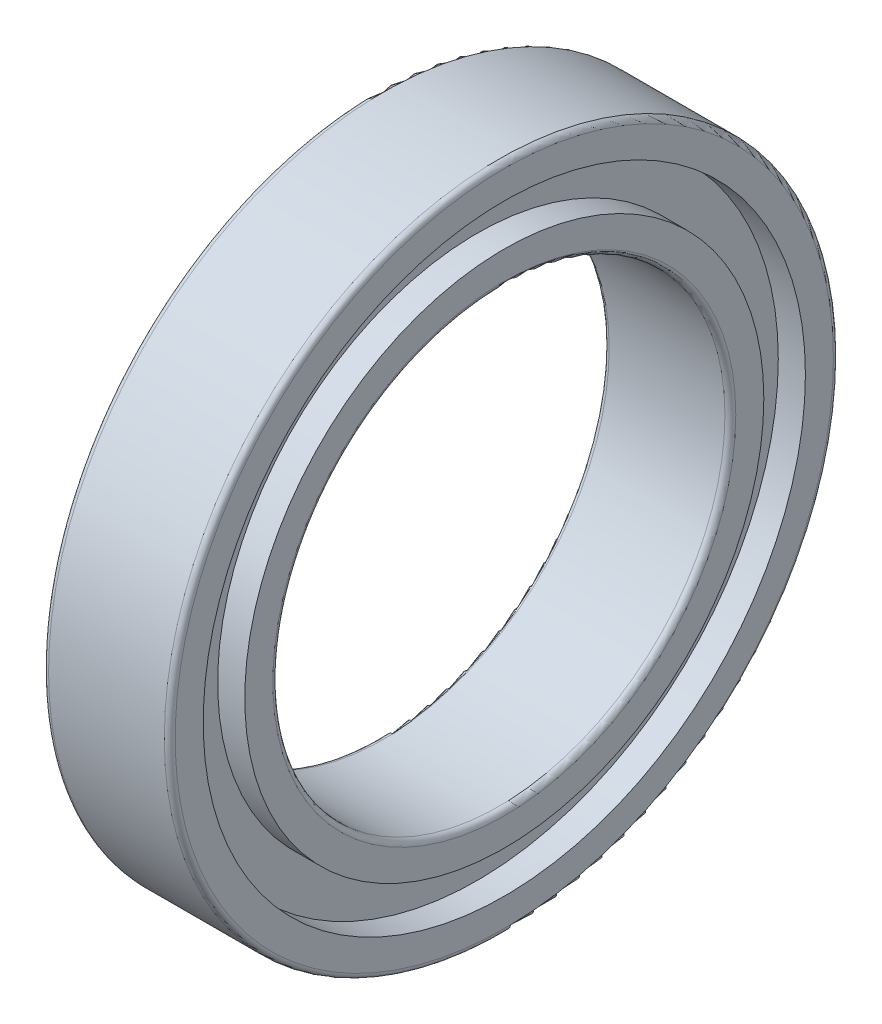
ISO-10303-21;
HEADER;
FILE_DESCRIPTION(('STEP AP214'),'2;1');
FILE_NAME('part.step','',(''),(''),'','','');
FILE_SCHEMA(('AUTOMOTIVE_DESIGN { 1 0 10303 214 1 1 1 1 }'));
ENDSEC;
DATA;
#1=APPLICATION_CONTEXT('core data for automotive mechanical design processes');
#2=APPLICATION_PROTOCOL_DEFINITION('international standard','automotive_design',2000,#1);
#3=PRODUCT_CONTEXT('',#1,'mechanical');
#4=PRODUCT('Part','Part','',(#3));
#5=PRODUCT_RELATED_PRODUCT_CATEGORY('part','',(#4));
#6=PRODUCT_DEFINITION_FORMATION('','',#4);
#7=PRODUCT_DEFINITION_CONTEXT('part definition',#1,'design');
#8=PRODUCT_DEFINITION('design','',#6,#7);
#9=PRODUCT_DEFINITION_SHAPE('','',#8);
#10=(LENGTH_UNIT() NAMED_UNIT(*) SI_UNIT(.MILLI.,.METRE.));
#11=(NAMED_UNIT(*) PLANE_ANGLE_UNIT() SI_UNIT($,.RADIAN.));
#12=(NAMED_UNIT(*) SI_UNIT($,.STERADIAN.) SOLID_ANGLE_UNIT());
#13=UNCERTAINTY_MEASURE_WITH_UNIT(LENGTH_MEASURE(1.E-05),#10,'distance_accuracy_value','');
#14=(GEOMETRIC_REPRESENTATION_CONTEXT(3) GLOBAL_UNCERTAINTY_ASSIGNED_CONTEXT((#13)) GLOBAL_UNIT_ASSIGNED_CONTEXT((#10,
#11,#12)) REPRESENTATION_CONTEXT('',''));
#15=CARTESIAN_POINT('',(0.,0.,0.));
#16=DIRECTION('',(0.,0.,1.));
#17=DIRECTION('',(1.,0.,0.));
#18=AXIS2_PLACEMENT_3D('',#15,#16,#17);
#19=CARTESIAN_POINT('',(-3.2,0.,0.));
#20=DIRECTION('',(1.,0.,0.));
#21=DIRECTION('',(0.,0.,-1.));
#22=AXIS2_PLACEMENT_3D('',#19,#20,#21);
#23=TOROIDAL_SURFACE('',#22,18.2,0.3);
#24=CARTESIAN_POINT('',(-3.5,0.,0.));
#25=DIRECTION('',(1.,0.,0.));
#26=DIRECTION('',(0.,0.,-1.));
#27=AXIS2_PLACEMENT_3D('',#24,#25,#26);
#28=CIRCLE('',#27,18.2);
#29=CARTESIAN_POINT('',(-3.5,0.,-18.2));
#30=VERTEX_POINT('',#29);
#31=EDGE_CURVE('E10',#30,#30,#28,.T.);
#32=ORIENTED_EDGE('',*,*,#31,.T.);
#33=EDGE_LOOP('',(#32));
#34=FACE_BOUND('',#33,.T.);
#35=CARTESIAN_POINT('',(-3.2,0.,0.));
#36=DIRECTION('',(1.,0.,0.));
#37=DIRECTION('',(0.,0.,-1.));
#38=AXIS2_PLACEMENT_3D('',#35,#36,#37);
#39=CIRCLE('',#38,18.5);
#40=CARTESIAN_POINT('',(-3.2,0.,-18.5));
#41=VERTEX_POINT('',#40);
#42=EDGE_CURVE('E123',#41,#41,#39,.T.);
#43=ORIENTED_EDGE('',*,*,#42,.F.);
#44=EDGE_LOOP('',(#43));
#45=FACE_BOUND('',#44,.T.);
#46=ADVANCED_FACE('F16',(#34,#45),#23,.T.);
#47=CARTESIAN_POINT('',(-3.5,16.65,0.));
#48=DIRECTION('',(1.,0.,0.));
#49=DIRECTION('',(0.,1.,0.));
#50=AXIS2_PLACEMENT_3D('',#47,#48,#49);
#51=PLANE('',#50);
#52=CARTESIAN_POINT('',(-3.5,0.,0.));
#53=DIRECTION('',(1.,0.,0.));
#54=DIRECTION('',(0.,0.,-1.));
#55=AXIS2_PLACEMENT_3D('',#52,#53,#54);
#56=CIRCLE('',#55,16.65);
#57=CARTESIAN_POINT('',(-3.5,0.,-16.65));
#58=VERTEX_POINT('',#57);
#59=EDGE_CURVE('E26',#58,#58,#56,.T.);
#60=ORIENTED_EDGE('',*,*,#59,.T.);
#61=EDGE_LOOP('',(#60));
#62=FACE_BOUND('',#61,.T.);
#63=ORIENTED_EDGE('',*,*,#31,.F.);
#64=EDGE_LOOP('',(#63));
#65=FACE_BOUND('',#64,.T.);
#66=ADVANCED_FACE('F198',(#62,#65),#51,.F.);
#67=CARTESIAN_POINT('',(3.5,0.,0.));
#68=DIRECTION('',(-1.,0.,0.));
#69=DIRECTION('',(0.,0.,-1.));
#70=AXIS2_PLACEMENT_3D('',#67,#68,#69);
#71=CYLINDRICAL_SURFACE('',#70,16.65);
#72=ORIENTED_EDGE('',*,*,#59,.F.);
#73=EDGE_LOOP('',(#72));
#74=FACE_BOUND('',#73,.T.);
#75=CARTESIAN_POINT('',(-2.,0.,0.));
#76=DIRECTION('',(1.,0.,0.));
#77=DIRECTION('',(0.,0.,-1.));
#78=AXIS2_PLACEMENT_3D('',#75,#76,#77);
#79=CIRCLE('',#78,16.65);
#80=CARTESIAN_POINT('',(-2.,0.,-16.65));
#81=VERTEX_POINT('',#80);
#82=EDGE_CURVE('E105',#81,#81,#79,.T.);
#83=ORIENTED_EDGE('',*,*,#82,.T.);
#84=EDGE_LOOP('',(#83));
#85=FACE_BOUND('',#84,.T.);
#86=ADVANCED_FACE('F106',(#74,#85),#71,.F.);
#87=CARTESIAN_POINT('',(-2.,14.35,0.));
#88=DIRECTION('',(1.,0.,0.));
#89=DIRECTION('',(0.,1.,0.));
#90=AXIS2_PLACEMENT_3D('',#87,#88,#89);
#91=PLANE('',#90);
#92=CARTESIAN_POINT('',(-2.,0.,0.));
#93=DIRECTION('',(1.,0.,0.));
#94=DIRECTION('',(0.,0.,-1.));
#95=AXIS2_PLACEMENT_3D('',#92,#93,#94);
#96=CIRCLE('',#95,14.35);
#97=CARTESIAN_POINT('',(-2.,0.,-14.35));
#98=VERTEX_POINT('',#97);
#99=EDGE_CURVE('E70',#98,#98,#96,.T.);
#100=ORIENTED_EDGE('',*,*,#99,.T.);
#101=EDGE_LOOP('',(#100));
#102=FACE_BOUND('',#101,.T.);
#103=ORIENTED_EDGE('',*,*,#82,.F.);
#104=EDGE_LOOP('',(#103));
#105=FACE_BOUND('',#104,.T.);
#106=ADVANCED_FACE('F18',(#102,#105),#91,.F.);
#107=CARTESIAN_POINT('',(3.2,0.,0.));
#108=DIRECTION('',(1.,0.,0.));
#109=DIRECTION('',(0.,0.,-1.));
#110=AXIS2_PLACEMENT_3D('',#107,#108,#109);
#111=TOROIDAL_SURFACE('',#110,12.8,0.3);
#112=CARTESIAN_POINT('',(3.5,0.,0.));
#113=DIRECTION('',(1.,0.,0.));
#114=DIRECTION('',(0.,0.,-1.));
#115=AXIS2_PLACEMENT_3D('',#112,#113,#114);
#116=CIRCLE('',#115,12.8);
#117=CARTESIAN_POINT('',(3.5,0.,-12.8));
#118=VERTEX_POINT('',#117);
#119=EDGE_CURVE('E144',#118,#118,#116,.T.);
#120=ORIENTED_EDGE('',*,*,#119,.T.);
#121=EDGE_LOOP('',(#120));
#122=FACE_BOUND('',#121,.T.);
#123=CARTESIAN_POINT('',(3.2,0.,0.));
#124=DIRECTION('',(1.,0.,0.));
#125=DIRECTION('',(0.,0.,-1.));
#126=AXIS2_PLACEMENT_3D('',#123,#124,#125);
#127=CIRCLE('',#126,12.5);
#128=CARTESIAN_POINT('',(3.2,0.,-12.5));
#129=VERTEX_POINT('',#128);
#130=EDGE_CURVE('E99',#129,#129,#127,.T.);
#131=ORIENTED_EDGE('',*,*,#130,.F.);
#132=EDGE_LOOP('',(#131));
#133=FACE_BOUND('',#132,.T.);
#134=ADVANCED_FACE('F152',(#122,#133),#111,.T.);
#135=CARTESIAN_POINT('',(50.,0.,0.));
#136=DIRECTION('',(-1.,0.,0.));
#137=DIRECTION('',(0.,0.,-1.));
#138=AXIS2_PLACEMENT_3D('',#135,#136,#137);
#139=CYLINDRICAL_SURFACE('',#138,12.5);
#140=ORIENTED_EDGE('',*,*,#130,.T.);
#141=EDGE_LOOP('',(#140));
#142=FACE_BOUND('',#141,.T.);
#143=CARTESIAN_POINT('',(-3.2,0.,0.));
#144=DIRECTION('',(1.,0.,0.));
#145=DIRECTION('',(0.,0.,-1.));
#146=AXIS2_PLACEMENT_3D('',#143,#144,#145);
#147=CIRCLE('',#146,12.5);
#148=CARTESIAN_POINT('',(-3.2,0.,-12.5));
#149=VERTEX_POINT('',#148);
#150=EDGE_CURVE('E113',#149,#149,#147,.T.);
#151=ORIENTED_EDGE('',*,*,#150,.F.);
#152=EDGE_LOOP('',(#151));
#153=FACE_BOUND('',#152,.T.);
#154=ADVANCED_FACE('F212',(#142,#153),#139,.F.);
#155=CARTESIAN_POINT('',(-3.2,0.,0.));
#156=DIRECTION('',(1.,0.,0.));
#157=DIRECTION('',(0.,0.,-1.));
#158=AXIS2_PLACEMENT_3D('',#155,#156,#157);
#159=TOROIDAL_SURFACE('',#158,12.8,0.3);
#160=ORIENTED_EDGE('',*,*,#150,.T.);
#161=EDGE_LOOP('',(#160));
#162=FACE_BOUND('',#161,.T.);
#163=CARTESIAN_POINT('',(-3.5,0.,0.));
#164=DIRECTION('',(1.,0.,0.));
#165=DIRECTION('',(0.,0.,-1.));
#166=AXIS2_PLACEMENT_3D('',#163,#164,#165);
#167=CIRCLE('',#166,12.8);
#168=CARTESIAN_POINT('',(-3.5,0.,-12.8));
#169=VERTEX_POINT('',#168);
#170=EDGE_CURVE('E78',#169,#169,#167,.T.);
#171=ORIENTED_EDGE('',*,*,#170,.F.);
#172=EDGE_LOOP('',(#171));
#173=FACE_BOUND('',#172,.T.);
#174=ADVANCED_FACE('F210',(#162,#173),#159,.T.);
#175=CARTESIAN_POINT('',(3.5,0.,0.));
#176=DIRECTION('',(-1.,0.,0.));
#177=DIRECTION('',(0.,0.,-1.));
#178=AXIS2_PLACEMENT_3D('',#175,#176,#177);
#179=CYLINDRICAL_SURFACE('',#178,14.35);
#180=ORIENTED_EDGE('',*,*,#99,.F.);
#181=EDGE_LOOP('',(#180));
#182=FACE_BOUND('',#181,.T.);
#183=CARTESIAN_POINT('',(-3.5,0.,0.));
#184=DIRECTION('',(1.,0.,0.));
#185=DIRECTION('',(0.,0.,-1.));
#186=AXIS2_PLACEMENT_3D('',#183,#184,#185);
#187=CIRCLE('',#186,14.35);
#188=CARTESIAN_POINT('',(-3.5,0.,-14.35));
#189=VERTEX_POINT('',#188);
#190=EDGE_CURVE('E120',#189,#189,#187,.T.);
#191=ORIENTED_EDGE('',*,*,#190,.T.);
#192=EDGE_LOOP('',(#191));
#193=FACE_BOUND('',#192,.T.);
#194=ADVANCED_FACE('F208',(#182,#193),#179,.T.);
#195=CARTESIAN_POINT('',(-3.5,0.,0.));
#196=DIRECTION('',(1.,0.,0.));
#197=DIRECTION('',(0.,1.,0.));
#198=AXIS2_PLACEMENT_3D('',#195,#196,#197);
#199=PLANE('',#198);
#200=ORIENTED_EDGE('',*,*,#170,.T.);
#201=EDGE_LOOP('',(#200));
#202=FACE_BOUND('',#201,.T.);
#203=ORIENTED_EDGE('',*,*,#190,.F.);
#204=EDGE_LOOP('',(#203));
#205=FACE_BOUND('',#204,.T.);
#206=ADVANCED_FACE('F194',(#202,#205),#199,.F.);
#207=CARTESIAN_POINT('',(3.5,0.,0.));
#208=DIRECTION('',(-1.,0.,0.));
#209=DIRECTION('',(0.,0.,-1.));
#210=AXIS2_PLACEMENT_3D('',#207,#208,#209);
#211=CYLINDRICAL_SURFACE('',#210,18.5);
#212=CARTESIAN_POINT('',(3.2,0.,0.));
#213=DIRECTION('',(1.,0.,0.));
#214=DIRECTION('',(0.,0.,-1.));
#215=AXIS2_PLACEMENT_3D('',#212,#213,#214);
#216=CIRCLE('',#215,18.5);
#217=CARTESIAN_POINT('',(3.2,0.,-18.5));
#218=VERTEX_POINT('',#217);
#219=EDGE_CURVE('E124',#218,#218,#216,.T.);
#220=ORIENTED_EDGE('',*,*,#219,.F.);
#221=EDGE_LOOP('',(#220));
#222=FACE_BOUND('',#221,.T.);
#223=ORIENTED_EDGE('',*,*,#42,.T.);
#224=EDGE_LOOP('',(#223));
#225=FACE_BOUND('',#224,.T.);
#226=ADVANCED_FACE('F187',(#222,#225),#211,.T.);
#227=CARTESIAN_POINT('',(3.2,0.,0.));
#228=DIRECTION('',(1.,0.,0.));
#229=DIRECTION('',(0.,0.,-1.));
#230=AXIS2_PLACEMENT_3D('',#227,#228,#229);
#231=TOROIDAL_SURFACE('',#230,18.2,0.3);
#232=ORIENTED_EDGE('',*,*,#219,.T.);
#233=EDGE_LOOP('',(#232));
#234=FACE_BOUND('',#233,.T.);
#235=CARTESIAN_POINT('',(3.5,0.,0.));
#236=DIRECTION('',(1.,0.,0.));
#237=DIRECTION('',(0.,0.,-1.));
#238=AXIS2_PLACEMENT_3D('',#235,#236,#237);
#239=CIRCLE('',#238,18.2);
#240=CARTESIAN_POINT('',(3.5,0.,-18.2));
#241=VERTEX_POINT('',#240);
#242=EDGE_CURVE('E127',#241,#241,#239,.T.);
#243=ORIENTED_EDGE('',*,*,#242,.F.);
#244=EDGE_LOOP('',(#243));
#245=FACE_BOUND('',#244,.T.);
#246=ADVANCED_FACE('F182',(#234,#245),#231,.T.);
#247=CARTESIAN_POINT('',(3.5,18.2,0.));
#248=DIRECTION('',(-1.,0.,0.));
#249=DIRECTION('',(0.,0.,1.));
#250=AXIS2_PLACEMENT_3D('',#247,#248,#249);
#251=PLANE('',#250);
#252=CARTESIAN_POINT('',(3.5,0.,0.));
#253=DIRECTION('',(1.,0.,0.));
#254=DIRECTION('',(0.,0.,-1.));
#255=AXIS2_PLACEMENT_3D('',#252,#253,#254);
#256=CIRCLE('',#255,16.65);
#257=CARTESIAN_POINT('',(3.5,0.,-16.65));
#258=VERTEX_POINT('',#257);
#259=EDGE_CURVE('E130',#258,#258,#256,.T.);
#260=ORIENTED_EDGE('',*,*,#259,.F.);
#261=EDGE_LOOP('',(#260));
#262=FACE_BOUND('',#261,.T.);
#263=ORIENTED_EDGE('',*,*,#242,.T.);
#264=EDGE_LOOP('',(#263));
#265=FACE_BOUND('',#264,.T.);
#266=ADVANCED_FACE('F176',(#262,#265),#251,.F.);
#267=CARTESIAN_POINT('',(3.5,0.,0.));
#268=DIRECTION('',(-1.,0.,0.));
#269=DIRECTION('',(0.,0.,-1.));
#270=AXIS2_PLACEMENT_3D('',#267,#268,#269);
#271=CYLINDRICAL_SURFACE('',#270,16.65);
#272=CARTESIAN_POINT('',(2.,0.,0.));
#273=DIRECTION('',(1.,0.,0.));
#274=DIRECTION('',(0.,0.,-1.));
#275=AXIS2_PLACEMENT_3D('',#272,#273,#274);
#276=CIRCLE('',#275,16.65);
#277=CARTESIAN_POINT('',(2.,0.,-16.65));
#278=VERTEX_POINT('',#277);
#279=EDGE_CURVE('E134',#278,#278,#276,.T.);
#280=ORIENTED_EDGE('',*,*,#279,.F.);
#281=EDGE_LOOP('',(#280));
#282=FACE_BOUND('',#281,.T.);
#283=ORIENTED_EDGE('',*,*,#259,.T.);
#284=EDGE_LOOP('',(#283));
#285=FACE_BOUND('',#284,.T.);
#286=ADVANCED_FACE('F170',(#282,#285),#271,.F.);
#287=CARTESIAN_POINT('',(2.,16.65,0.));
#288=DIRECTION('',(-1.,0.,0.));
#289=DIRECTION('',(0.,0.,1.));
#290=AXIS2_PLACEMENT_3D('',#287,#288,#289);
#291=PLANE('',#290);
#292=CARTESIAN_POINT('',(2.,0.,0.));
#293=DIRECTION('',(1.,0.,0.));
#294=DIRECTION('',(0.,0.,-1.));
#295=AXIS2_PLACEMENT_3D('',#292,#293,#294);
#296=CIRCLE('',#295,14.35);
#297=CARTESIAN_POINT('',(2.,0.,-14.35));
#298=VERTEX_POINT('',#297);
#299=EDGE_CURVE('E139',#298,#298,#296,.T.);
#300=ORIENTED_EDGE('',*,*,#299,.F.);
#301=EDGE_LOOP('',(#300));
#302=FACE_BOUND('',#301,.T.);
#303=ORIENTED_EDGE('',*,*,#279,.T.);
#304=EDGE_LOOP('',(#303));
#305=FACE_BOUND('',#304,.T.);
#306=ADVANCED_FACE('F164',(#302,#305),#291,.F.);
#307=CARTESIAN_POINT('',(3.5,0.,0.));
#308=DIRECTION('',(-1.,0.,0.));
#309=DIRECTION('',(0.,0.,-1.));
#310=AXIS2_PLACEMENT_3D('',#307,#308,#309);
#311=CYLINDRICAL_SURFACE('',#310,14.35);
#312=CARTESIAN_POINT('',(3.5,0.,0.));
#313=DIRECTION('',(1.,0.,0.));
#314=DIRECTION('',(0.,0.,-1.));
#315=AXIS2_PLACEMENT_3D('',#312,#313,#314);
#316=CIRCLE('',#315,14.35);
#317=CARTESIAN_POINT('',(3.5,0.,-14.35));
#318=VERTEX_POINT('',#317);
#319=EDGE_CURVE('E145',#318,#318,#316,.T.);
#320=ORIENTED_EDGE('',*,*,#319,.F.);
#321=EDGE_LOOP('',(#320));
#322=FACE_BOUND('',#321,.T.);
#323=ORIENTED_EDGE('',*,*,#299,.T.);
#324=EDGE_LOOP('',(#323));
#325=FACE_BOUND('',#324,.T.);
#326=ADVANCED_FACE('F158',(#322,#325),#311,.T.);
#327=CARTESIAN_POINT('',(3.5,14.35,0.));
#328=DIRECTION('',(-1.,0.,0.));
#329=DIRECTION('',(0.,0.,1.));
#330=AXIS2_PLACEMENT_3D('',#327,#328,#329);
#331=PLANE('',#330);
#332=ORIENTED_EDGE('',*,*,#119,.F.);
#333=EDGE_LOOP('',(#332));
#334=FACE_BOUND('',#333,.T.);
#335=ORIENTED_EDGE('',*,*,#319,.T.);
#336=EDGE_LOOP('',(#335));
#337=FACE_BOUND('',#336,.T.);
#338=ADVANCED_FACE('F155',(#334,#337),#331,.F.);
#339=CLOSED_SHELL('',(#46,#66,#86,#106,#134,#154,#174,#194,#206,#226,#246,#266,#286,#306,#326,#338));
#340=MANIFOLD_SOLID_BREP('B1',#339);
#341=ADVANCED_BREP_SHAPE_REPRESENTATION('',(#18,#340),#14);
#342=SHAPE_DEFINITION_REPRESENTATION(#9,#341);
ENDSEC;
END-ISO-10303-21;
